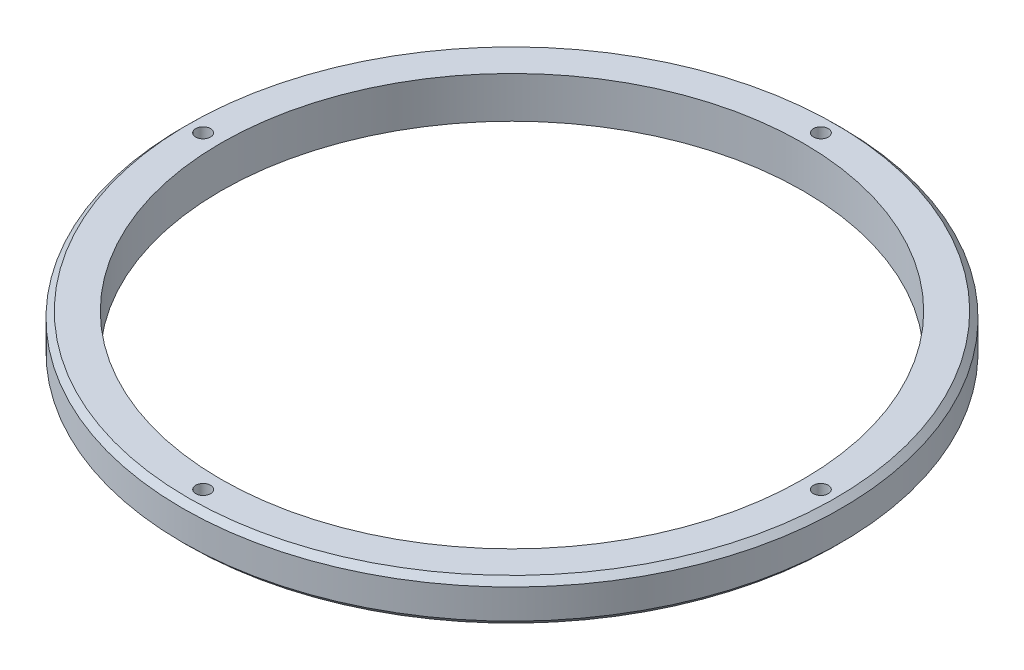
ISO-10303-21;
HEADER;
FILE_DESCRIPTION(('STEP AP214'),'2;1');
FILE_NAME('part.step','',(''),(''),'','','');
FILE_SCHEMA(('AUTOMOTIVE_DESIGN { 1 0 10303 214 1 1 1 1 }'));
ENDSEC;
DATA;
#1=APPLICATION_CONTEXT('core data for automotive mechanical design processes');
#2=APPLICATION_PROTOCOL_DEFINITION('international standard','automotive_design',2000,#1);
#3=PRODUCT_CONTEXT('',#1,'mechanical');
#4=PRODUCT('Part','Part','',(#3));
#5=PRODUCT_RELATED_PRODUCT_CATEGORY('part','',(#4));
#6=PRODUCT_DEFINITION_FORMATION('','',#4);
#7=PRODUCT_DEFINITION_CONTEXT('part definition',#1,'design');
#8=PRODUCT_DEFINITION('design','',#6,#7);
#9=PRODUCT_DEFINITION_SHAPE('','',#8);
#10=(LENGTH_UNIT() NAMED_UNIT(*) SI_UNIT(.MILLI.,.METRE.));
#11=(NAMED_UNIT(*) PLANE_ANGLE_UNIT() SI_UNIT($,.RADIAN.));
#12=(NAMED_UNIT(*) SI_UNIT($,.STERADIAN.) SOLID_ANGLE_UNIT());
#13=UNCERTAINTY_MEASURE_WITH_UNIT(LENGTH_MEASURE(1.E-05),#10,'distance_accuracy_value','');
#14=(GEOMETRIC_REPRESENTATION_CONTEXT(3) GLOBAL_UNCERTAINTY_ASSIGNED_CONTEXT((#13)) GLOBAL_UNIT_ASSIGNED_CONTEXT((#10,
#11,#12)) REPRESENTATION_CONTEXT('',''));
#15=CARTESIAN_POINT('',(0.,0.,0.));
#16=DIRECTION('',(0.,0.,1.));
#17=DIRECTION('',(1.,0.,0.));
#18=AXIS2_PLACEMENT_3D('',#15,#16,#17);
#19=CARTESIAN_POINT('',(0.,14.,0.));
#20=DIRECTION('',(0.,1.,0.));
#21=DIRECTION('',(0.,0.,1.));
#22=AXIS2_PLACEMENT_3D('',#19,#20,#21);
#23=PLANE('',#22);
#24=CARTESIAN_POINT('',(0.,14.,0.));
#25=DIRECTION('',(0.,1.,0.));
#26=DIRECTION('',(0.,0.,1.));
#27=AXIS2_PLACEMENT_3D('',#24,#25,#26);
#28=CIRCLE('',#27,109.5);
#29=CARTESIAN_POINT('',(0.,14.,109.5));
#30=VERTEX_POINT('',#29);
#31=EDGE_CURVE('E10',#30,#30,#28,.T.);
#32=ORIENTED_EDGE('',*,*,#31,.T.);
#33=EDGE_LOOP('',(#32));
#34=FACE_BOUND('',#33,.T.);
#35=CARTESIAN_POINT('',(5.90174459380117E-12,14.,104.5));
#36=DIRECTION('',(0.,1.,0.));
#37=DIRECTION('',(0.,0.,1.));
#38=AXIS2_PLACEMENT_3D('',#35,#36,#37);
#39=CIRCLE('',#38,2.50000000000635);
#40=CARTESIAN_POINT('',(5.90174459380117E-12,14.,107.000000000006));
#41=VERTEX_POINT('',#40);
#42=EDGE_CURVE('E73',#41,#41,#39,.T.);
#43=ORIENTED_EDGE('',*,*,#42,.F.);
#44=EDGE_LOOP('',(#43));
#45=FACE_BOUND('',#44,.T.);
#46=CARTESIAN_POINT('',(0.,14.,-104.5));
#47=DIRECTION('',(0.,1.,0.));
#48=DIRECTION('',(0.,0.,1.));
#49=AXIS2_PLACEMENT_3D('',#46,#47,#48);
#50=CIRCLE('',#49,2.5);
#51=CARTESIAN_POINT('',(0.,14.,-102.));
#52=VERTEX_POINT('',#51);
#53=EDGE_CURVE('E61',#52,#52,#50,.T.);
#54=ORIENTED_EDGE('',*,*,#53,.F.);
#55=EDGE_LOOP('',(#54));
#56=FACE_BOUND('',#55,.T.);
#57=CARTESIAN_POINT('',(0.,14.,0.));
#58=DIRECTION('',(0.,1.,0.));
#59=DIRECTION('',(0.,0.,1.));
#60=AXIS2_PLACEMENT_3D('',#57,#58,#59);
#61=CIRCLE('',#60,98.5);
#62=CARTESIAN_POINT('',(0.,14.,98.5));
#63=VERTEX_POINT('',#62);
#64=EDGE_CURVE('E57',#63,#63,#61,.T.);
#65=ORIENTED_EDGE('',*,*,#64,.F.);
#66=EDGE_LOOP('',(#65));
#67=FACE_BOUND('',#66,.T.);
#68=CARTESIAN_POINT('',(104.500000000003,14.,-2.95087229690058E-12));
#69=DIRECTION('',(0.,1.,0.));
#70=DIRECTION('',(0.,0.,1.));
#71=AXIS2_PLACEMENT_3D('',#68,#69,#70);
#72=CIRCLE('',#71,2.50000000000232);
#73=CARTESIAN_POINT('',(104.500000000003,14.,2.49999999999937));
#74=VERTEX_POINT('',#73);
#75=EDGE_CURVE('E67',#74,#74,#72,.T.);
#76=ORIENTED_EDGE('',*,*,#75,.F.);
#77=EDGE_LOOP('',(#76));
#78=FACE_BOUND('',#77,.T.);
#79=CARTESIAN_POINT('',(-104.499999999997,14.,2.96366985595167E-12));
#80=DIRECTION('',(0.,1.,0.));
#81=DIRECTION('',(0.,0.,1.));
#82=AXIS2_PLACEMENT_3D('',#79,#80,#81);
#83=CIRCLE('',#82,2.50000000000475);
#84=CARTESIAN_POINT('',(-104.499999999997,14.,2.50000000000771));
#85=VERTEX_POINT('',#84);
#86=EDGE_CURVE('E79',#85,#85,#83,.T.);
#87=ORIENTED_EDGE('',*,*,#86,.F.);
#88=EDGE_LOOP('',(#87));
#89=FACE_BOUND('',#88,.T.);
#90=ADVANCED_FACE('F36',(#34,#45,#56,#67,#78,#89),#23,.T.);
#91=CARTESIAN_POINT('',(0.,0.,0.));
#92=DIRECTION('',(0.,1.,0.));
#93=DIRECTION('',(0.,0.,1.));
#94=AXIS2_PLACEMENT_3D('',#91,#92,#93);
#95=PLANE('',#94);
#96=CARTESIAN_POINT('',(0.,0.,0.));
#97=DIRECTION('',(0.,1.,0.));
#98=DIRECTION('',(0.,0.,1.));
#99=AXIS2_PLACEMENT_3D('',#96,#97,#98);
#100=CIRCLE('',#99,109.5);
#101=CARTESIAN_POINT('',(0.,0.,109.5));
#102=VERTEX_POINT('',#101);
#103=EDGE_CURVE('E44',#102,#102,#100,.F.);
#104=ORIENTED_EDGE('',*,*,#103,.T.);
#105=EDGE_LOOP('',(#104));
#106=FACE_BOUND('',#105,.T.);
#107=CARTESIAN_POINT('',(0.,0.,0.));
#108=DIRECTION('',(0.,1.,0.));
#109=DIRECTION('',(0.,0.,1.));
#110=AXIS2_PLACEMENT_3D('',#107,#108,#109);
#111=CIRCLE('',#110,98.5);
#112=CARTESIAN_POINT('',(0.,0.,98.5));
#113=VERTEX_POINT('',#112);
#114=EDGE_CURVE('E58',#113,#113,#111,.T.);
#115=ORIENTED_EDGE('',*,*,#114,.T.);
#116=EDGE_LOOP('',(#115));
#117=FACE_BOUND('',#116,.T.);
#118=CARTESIAN_POINT('',(0.,0.,-104.5));
#119=DIRECTION('',(0.,1.,0.));
#120=DIRECTION('',(0.,0.,1.));
#121=AXIS2_PLACEMENT_3D('',#118,#119,#120);
#122=CIRCLE('',#121,2.5);
#123=CARTESIAN_POINT('',(0.,0.,-102.));
#124=VERTEX_POINT('',#123);
#125=EDGE_CURVE('E64',#124,#124,#122,.T.);
#126=ORIENTED_EDGE('',*,*,#125,.T.);
#127=EDGE_LOOP('',(#126));
#128=FACE_BOUND('',#127,.T.);
#129=CARTESIAN_POINT('',(104.500000000003,0.,-2.95087229690058E-12));
#130=DIRECTION('',(0.,1.,0.));
#131=DIRECTION('',(0.,0.,1.));
#132=AXIS2_PLACEMENT_3D('',#129,#130,#131);
#133=CIRCLE('',#132,2.50000000000232);
#134=CARTESIAN_POINT('',(104.500000000003,0.,2.49999999999937));
#135=VERTEX_POINT('',#134);
#136=EDGE_CURVE('E70',#135,#135,#133,.T.);
#137=ORIENTED_EDGE('',*,*,#136,.T.);
#138=EDGE_LOOP('',(#137));
#139=FACE_BOUND('',#138,.T.);
#140=CARTESIAN_POINT('',(5.90174459380117E-12,0.,104.5));
#141=DIRECTION('',(0.,1.,0.));
#142=DIRECTION('',(0.,0.,1.));
#143=AXIS2_PLACEMENT_3D('',#140,#141,#142);
#144=CIRCLE('',#143,2.50000000000635);
#145=CARTESIAN_POINT('',(5.90174459380117E-12,0.,107.000000000006));
#146=VERTEX_POINT('',#145);
#147=EDGE_CURVE('E76',#146,#146,#144,.T.);
#148=ORIENTED_EDGE('',*,*,#147,.T.);
#149=EDGE_LOOP('',(#148));
#150=FACE_BOUND('',#149,.T.);
#151=CARTESIAN_POINT('',(-104.499999999997,0.,2.96366985595167E-12));
#152=DIRECTION('',(0.,1.,0.));
#153=DIRECTION('',(0.,0.,1.));
#154=AXIS2_PLACEMENT_3D('',#151,#152,#153);
#155=CIRCLE('',#154,2.50000000000475);
#156=CARTESIAN_POINT('',(-104.499999999997,0.,2.50000000000771));
#157=VERTEX_POINT('',#156);
#158=EDGE_CURVE('E82',#157,#157,#155,.T.);
#159=ORIENTED_EDGE('',*,*,#158,.T.);
#160=EDGE_LOOP('',(#159));
#161=FACE_BOUND('',#160,.T.);
#162=ADVANCED_FACE('F92',(#106,#117,#128,#139,#150,#161),#95,.F.);
#163=CARTESIAN_POINT('',(0.,14.,0.));
#164=DIRECTION('',(0.,-1.,0.));
#165=DIRECTION('',(0.,0.,-1.));
#166=AXIS2_PLACEMENT_3D('',#163,#164,#165);
#167=CYLINDRICAL_SURFACE('',#166,111.5);
#168=CARTESIAN_POINT('',(0.,1.99999999999999,0.));
#169=DIRECTION('',(0.,1.,0.));
#170=DIRECTION('',(0.,0.,1.));
#171=AXIS2_PLACEMENT_3D('',#168,#169,#170);
#172=CIRCLE('',#171,111.5);
#173=CARTESIAN_POINT('',(0.,1.99999999999999,111.5));
#174=VERTEX_POINT('',#173);
#175=EDGE_CURVE('E48',#174,#174,#172,.T.);
#176=ORIENTED_EDGE('',*,*,#175,.T.);
#177=EDGE_LOOP('',(#176));
#178=FACE_BOUND('',#177,.T.);
#179=CARTESIAN_POINT('',(0.,12.,0.));
#180=DIRECTION('',(0.,1.,0.));
#181=DIRECTION('',(0.,0.,1.));
#182=AXIS2_PLACEMENT_3D('',#179,#180,#181);
#183=CIRCLE('',#182,111.5);
#184=CARTESIAN_POINT('',(0.,12.,111.5));
#185=VERTEX_POINT('',#184);
#186=EDGE_CURVE('E52',#185,#185,#183,.F.);
#187=ORIENTED_EDGE('',*,*,#186,.T.);
#188=EDGE_LOOP('',(#187));
#189=FACE_BOUND('',#188,.T.);
#190=ADVANCED_FACE('F97',(#178,#189),#167,.T.);
#191=CARTESIAN_POINT('',(0.,14.,0.));
#192=DIRECTION('',(0.,-1.,0.));
#193=DIRECTION('',(0.,0.,-1.));
#194=AXIS2_PLACEMENT_3D('',#191,#192,#193);
#195=CYLINDRICAL_SURFACE('',#194,98.5);
#196=ORIENTED_EDGE('',*,*,#64,.T.);
#197=EDGE_LOOP('',(#196));
#198=FACE_BOUND('',#197,.T.);
#199=ORIENTED_EDGE('',*,*,#114,.F.);
#200=EDGE_LOOP('',(#199));
#201=FACE_BOUND('',#200,.T.);
#202=ADVANCED_FACE('F101',(#198,#201),#195,.F.);
#203=CARTESIAN_POINT('',(0.,14.,-104.5));
#204=DIRECTION('',(0.,-1.,0.));
#205=DIRECTION('',(0.,0.,-1.));
#206=AXIS2_PLACEMENT_3D('',#203,#204,#205);
#207=CYLINDRICAL_SURFACE('',#206,2.5);
#208=ORIENTED_EDGE('',*,*,#53,.T.);
#209=EDGE_LOOP('',(#208));
#210=FACE_BOUND('',#209,.T.);
#211=ORIENTED_EDGE('',*,*,#125,.F.);
#212=EDGE_LOOP('',(#211));
#213=FACE_BOUND('',#212,.T.);
#214=ADVANCED_FACE('F132',(#210,#213),#207,.F.);
#215=CARTESIAN_POINT('',(104.500000000003,14.,-2.95087229690058E-12));
#216=DIRECTION('',(0.,-1.,0.));
#217=DIRECTION('',(0.,0.,-1.));
#218=AXIS2_PLACEMENT_3D('',#215,#216,#217);
#219=CYLINDRICAL_SURFACE('',#218,2.50000000000232);
#220=ORIENTED_EDGE('',*,*,#75,.T.);
#221=EDGE_LOOP('',(#220));
#222=FACE_BOUND('',#221,.T.);
#223=ORIENTED_EDGE('',*,*,#136,.F.);
#224=EDGE_LOOP('',(#223));
#225=FACE_BOUND('',#224,.T.);
#226=ADVANCED_FACE('F127',(#222,#225),#219,.F.);
#227=CARTESIAN_POINT('',(5.90174459380117E-12,14.,104.5));
#228=DIRECTION('',(0.,-1.,0.));
#229=DIRECTION('',(0.,0.,-1.));
#230=AXIS2_PLACEMENT_3D('',#227,#228,#229);
#231=CYLINDRICAL_SURFACE('',#230,2.50000000000635);
#232=ORIENTED_EDGE('',*,*,#42,.T.);
#233=EDGE_LOOP('',(#232));
#234=FACE_BOUND('',#233,.T.);
#235=ORIENTED_EDGE('',*,*,#147,.F.);
#236=EDGE_LOOP('',(#235));
#237=FACE_BOUND('',#236,.T.);
#238=ADVANCED_FACE('F117',(#234,#237),#231,.F.);
#239=CARTESIAN_POINT('',(-104.499999999997,14.,2.96366985595167E-12));
#240=DIRECTION('',(0.,-1.,0.));
#241=DIRECTION('',(0.,0.,-1.));
#242=AXIS2_PLACEMENT_3D('',#239,#240,#241);
#243=CYLINDRICAL_SURFACE('',#242,2.50000000000475);
#244=ORIENTED_EDGE('',*,*,#86,.T.);
#245=EDGE_LOOP('',(#244));
#246=FACE_BOUND('',#245,.T.);
#247=ORIENTED_EDGE('',*,*,#158,.F.);
#248=EDGE_LOOP('',(#247));
#249=FACE_BOUND('',#248,.T.);
#250=ADVANCED_FACE('F88',(#246,#249),#243,.F.);
#251=CARTESIAN_POINT('',(0.,1.99999999999999,0.));
#252=DIRECTION('',(0.,1.,0.));
#253=DIRECTION('',(0.,0.,1.));
#254=AXIS2_PLACEMENT_3D('',#251,#252,#253);
#255=CONICAL_SURFACE('',#254,111.5,0.785398163397448);
#256=ORIENTED_EDGE('',*,*,#103,.F.);
#257=EDGE_LOOP('',(#256));
#258=FACE_BOUND('',#257,.T.);
#259=ORIENTED_EDGE('',*,*,#175,.F.);
#260=EDGE_LOOP('',(#259));
#261=FACE_BOUND('',#260,.T.);
#262=ADVANCED_FACE('F107',(#258,#261),#255,.T.);
#263=CARTESIAN_POINT('',(0.,14.,0.));
#264=DIRECTION('',(0.,-1.,0.));
#265=DIRECTION('',(0.,0.,-1.));
#266=AXIS2_PLACEMENT_3D('',#263,#264,#265);
#267=CONICAL_SURFACE('',#266,109.5,0.785398163397448);
#268=ORIENTED_EDGE('',*,*,#186,.F.);
#269=EDGE_LOOP('',(#268));
#270=FACE_BOUND('',#269,.T.);
#271=ORIENTED_EDGE('',*,*,#31,.F.);
#272=EDGE_LOOP('',(#271));
#273=FACE_BOUND('',#272,.T.);
#274=ADVANCED_FACE('F39',(#270,#273),#267,.T.);
#275=CLOSED_SHELL('',(#90,#162,#190,#202,#214,#226,#238,#250,#262,#274));
#276=MANIFOLD_SOLID_BREP('B2',#275);
#277=ADVANCED_BREP_SHAPE_REPRESENTATION('',(#18,#276),#14);
#278=SHAPE_DEFINITION_REPRESENTATION(#9,#277);
ENDSEC;
END-ISO-10303-21;
